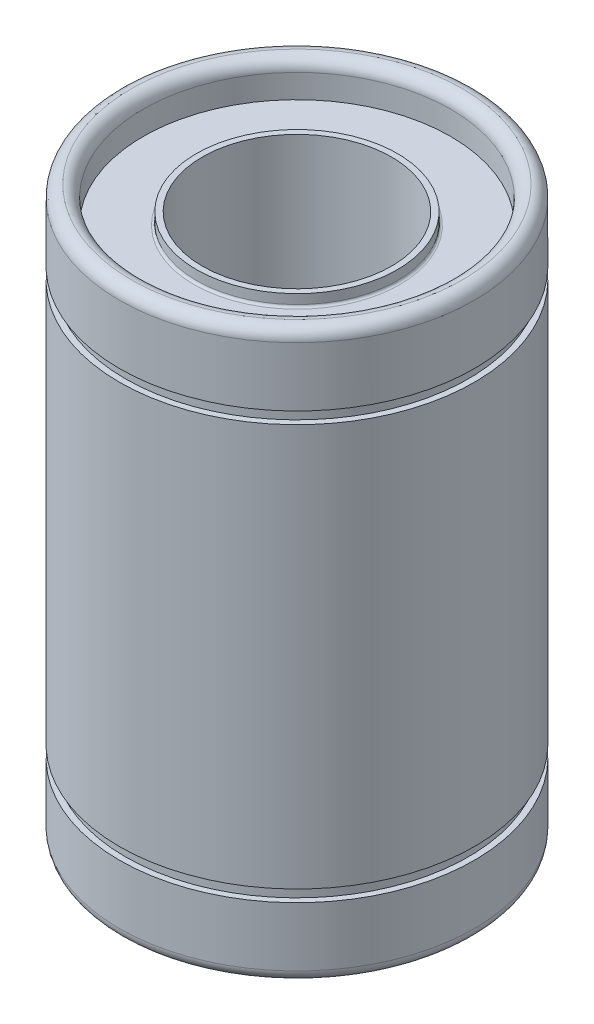
ISO-10303-21;
HEADER;
FILE_DESCRIPTION(('STEP AP214'),'2;1');
FILE_NAME('part.step','',(''),(''),'','','');
FILE_SCHEMA(('AUTOMOTIVE_DESIGN { 1 0 10303 214 1 1 1 1 }'));
ENDSEC;
DATA;
#1=APPLICATION_CONTEXT('core data for automotive mechanical design processes');
#2=APPLICATION_PROTOCOL_DEFINITION('international standard','automotive_design',2000,#1);
#3=PRODUCT_CONTEXT('',#1,'mechanical');
#4=PRODUCT('Part','Part','',(#3));
#5=PRODUCT_RELATED_PRODUCT_CATEGORY('part','',(#4));
#6=PRODUCT_DEFINITION_FORMATION('','',#4);
#7=PRODUCT_DEFINITION_CONTEXT('part definition',#1,'design');
#8=PRODUCT_DEFINITION('design','',#6,#7);
#9=PRODUCT_DEFINITION_SHAPE('','',#8);
#10=(LENGTH_UNIT() NAMED_UNIT(*) SI_UNIT(.MILLI.,.METRE.));
#11=(NAMED_UNIT(*) PLANE_ANGLE_UNIT() SI_UNIT($,.RADIAN.));
#12=(NAMED_UNIT(*) SI_UNIT($,.STERADIAN.) SOLID_ANGLE_UNIT());
#13=UNCERTAINTY_MEASURE_WITH_UNIT(LENGTH_MEASURE(1.E-05),#10,'distance_accuracy_value','');
#14=(GEOMETRIC_REPRESENTATION_CONTEXT(3) GLOBAL_UNCERTAINTY_ASSIGNED_CONTEXT((#13)) GLOBAL_UNIT_ASSIGNED_CONTEXT((#10,
#11,#12)) REPRESENTATION_CONTEXT('',''));
#15=CARTESIAN_POINT('',(0.,0.,0.));
#16=DIRECTION('',(0.,0.,1.));
#17=DIRECTION('',(1.,0.,0.));
#18=AXIS2_PLACEMENT_3D('',#15,#16,#17);
#19=CARTESIAN_POINT('',(0.,22.5,0.));
#20=DIRECTION('',(0.,1.,0.));
#21=DIRECTION('',(0.,0.,1.));
#22=AXIS2_PLACEMENT_3D('',#19,#20,#21);
#23=PLANE('',#22);
#24=CARTESIAN_POINT('',(0.,22.5,0.));
#25=DIRECTION('',(0.,1.,0.));
#26=DIRECTION('',(0.,0.,1.));
#27=AXIS2_PLACEMENT_3D('',#24,#25,#26);
#28=CIRCLE('',#27,4.35);
#29=CARTESIAN_POINT('',(0.,22.5,4.35));
#30=VERTEX_POINT('',#29);
#31=EDGE_CURVE('E10',#30,#30,#28,.F.);
#32=ORIENTED_EDGE('',*,*,#31,.T.);
#33=EDGE_LOOP('',(#32));
#34=FACE_BOUND('',#33,.T.);
#35=CARTESIAN_POINT('',(0.,22.5,0.));
#36=DIRECTION('',(0.,1.,0.));
#37=DIRECTION('',(0.,0.,1.));
#38=AXIS2_PLACEMENT_3D('',#35,#36,#37);
#39=CIRCLE('',#38,6.5);
#40=CARTESIAN_POINT('',(0.,22.5,6.5));
#41=VERTEX_POINT('',#40);
#42=EDGE_CURVE('E99',#41,#41,#39,.T.);
#43=ORIENTED_EDGE('',*,*,#42,.T.);
#44=EDGE_LOOP('',(#43));
#45=FACE_BOUND('',#44,.T.);
#46=ADVANCED_FACE('F36',(#34,#45),#23,.T.);
#47=CARTESIAN_POINT('',(0.,24.,0.));
#48=DIRECTION('',(0.,1.,0.));
#49=DIRECTION('',(0.,0.,1.));
#50=AXIS2_PLACEMENT_3D('',#47,#48,#49);
#51=CYLINDRICAL_SURFACE('',#50,7.5);
#52=CARTESIAN_POINT('',(0.,0.5,0.));
#53=DIRECTION('',(0.,1.,0.));
#54=DIRECTION('',(0.,0.,1.));
#55=AXIS2_PLACEMENT_3D('',#52,#53,#54);
#56=CIRCLE('',#55,7.5);
#57=CARTESIAN_POINT('',(0.,0.5,7.5));
#58=VERTEX_POINT('',#57);
#59=EDGE_CURVE('E63',#58,#58,#56,.T.);
#60=ORIENTED_EDGE('',*,*,#59,.T.);
#61=EDGE_LOOP('',(#60));
#62=FACE_BOUND('',#61,.T.);
#63=CARTESIAN_POINT('',(0.,3.,0.));
#64=DIRECTION('',(0.,1.,0.));
#65=DIRECTION('',(0.,0.,1.));
#66=AXIS2_PLACEMENT_3D('',#63,#64,#65);
#67=CIRCLE('',#66,7.5);
#68=CARTESIAN_POINT('',(0.,3.,7.5));
#69=VERTEX_POINT('',#68);
#70=EDGE_CURVE('E75',#69,#69,#67,.T.);
#71=ORIENTED_EDGE('',*,*,#70,.F.);
#72=EDGE_LOOP('',(#71));
#73=FACE_BOUND('',#72,.T.);
#74=ADVANCED_FACE('F138',(#62,#73),#51,.T.);
#75=CARTESIAN_POINT('',(7.25,3.,0.));
#76=DIRECTION('',(0.,-1.,0.));
#77=DIRECTION('',(0.,0.,-1.));
#78=AXIS2_PLACEMENT_3D('',#75,#76,#77);
#79=PLANE('',#78);
#80=CARTESIAN_POINT('',(0.,3.,0.));
#81=DIRECTION('',(0.,1.,0.));
#82=DIRECTION('',(0.,0.,1.));
#83=AXIS2_PLACEMENT_3D('',#80,#81,#82);
#84=CIRCLE('',#83,7.25);
#85=CARTESIAN_POINT('',(0.,3.,7.25));
#86=VERTEX_POINT('',#85);
#87=EDGE_CURVE('E78',#86,#86,#84,.T.);
#88=ORIENTED_EDGE('',*,*,#87,.F.);
#89=EDGE_LOOP('',(#88));
#90=FACE_BOUND('',#89,.T.);
#91=ORIENTED_EDGE('',*,*,#70,.T.);
#92=EDGE_LOOP('',(#91));
#93=FACE_BOUND('',#92,.T.);
#94=ADVANCED_FACE('F143',(#90,#93),#79,.F.);
#95=CARTESIAN_POINT('',(0.,24.,0.));
#96=DIRECTION('',(0.,1.,0.));
#97=DIRECTION('',(0.,0.,1.));
#98=AXIS2_PLACEMENT_3D('',#95,#96,#97);
#99=CYLINDRICAL_SURFACE('',#98,7.25);
#100=CARTESIAN_POINT('',(0.,3.5,0.));
#101=DIRECTION('',(0.,1.,0.));
#102=DIRECTION('',(0.,0.,1.));
#103=AXIS2_PLACEMENT_3D('',#100,#101,#102);
#104=CIRCLE('',#103,7.25);
#105=CARTESIAN_POINT('',(0.,3.5,7.25));
#106=VERTEX_POINT('',#105);
#107=EDGE_CURVE('E81',#106,#106,#104,.T.);
#108=ORIENTED_EDGE('',*,*,#107,.F.);
#109=EDGE_LOOP('',(#108));
#110=FACE_BOUND('',#109,.T.);
#111=ORIENTED_EDGE('',*,*,#87,.T.);
#112=EDGE_LOOP('',(#111));
#113=FACE_BOUND('',#112,.T.);
#114=ADVANCED_FACE('F176',(#110,#113),#99,.T.);
#115=CARTESIAN_POINT('',(7.5,3.5,0.));
#116=DIRECTION('',(0.,1.,0.));
#117=DIRECTION('',(0.,0.,1.));
#118=AXIS2_PLACEMENT_3D('',#115,#116,#117);
#119=PLANE('',#118);
#120=CARTESIAN_POINT('',(0.,3.5,0.));
#121=DIRECTION('',(0.,1.,0.));
#122=DIRECTION('',(0.,0.,1.));
#123=AXIS2_PLACEMENT_3D('',#120,#121,#122);
#124=CIRCLE('',#123,7.5);
#125=CARTESIAN_POINT('',(0.,3.5,7.5));
#126=VERTEX_POINT('',#125);
#127=EDGE_CURVE('E84',#126,#126,#124,.T.);
#128=ORIENTED_EDGE('',*,*,#127,.F.);
#129=EDGE_LOOP('',(#128));
#130=FACE_BOUND('',#129,.T.);
#131=ORIENTED_EDGE('',*,*,#107,.T.);
#132=EDGE_LOOP('',(#131));
#133=FACE_BOUND('',#132,.T.);
#134=ADVANCED_FACE('F172',(#130,#133),#119,.F.);
#135=CARTESIAN_POINT('',(0.,24.,0.));
#136=DIRECTION('',(0.,1.,0.));
#137=DIRECTION('',(0.,0.,1.));
#138=AXIS2_PLACEMENT_3D('',#135,#136,#137);
#139=CYLINDRICAL_SURFACE('',#138,7.5);
#140=CARTESIAN_POINT('',(0.,20.5,0.));
#141=DIRECTION('',(0.,1.,0.));
#142=DIRECTION('',(0.,0.,1.));
#143=AXIS2_PLACEMENT_3D('',#140,#141,#142);
#144=CIRCLE('',#143,7.5);
#145=CARTESIAN_POINT('',(0.,20.5,7.5));
#146=VERTEX_POINT('',#145);
#147=EDGE_CURVE('E87',#146,#146,#144,.T.);
#148=ORIENTED_EDGE('',*,*,#147,.F.);
#149=EDGE_LOOP('',(#148));
#150=FACE_BOUND('',#149,.T.);
#151=ORIENTED_EDGE('',*,*,#127,.T.);
#152=EDGE_LOOP('',(#151));
#153=FACE_BOUND('',#152,.T.);
#154=ADVANCED_FACE('F168',(#150,#153),#139,.T.);
#155=CARTESIAN_POINT('',(7.25,20.5,0.));
#156=DIRECTION('',(0.,-1.,0.));
#157=DIRECTION('',(0.,0.,-1.));
#158=AXIS2_PLACEMENT_3D('',#155,#156,#157);
#159=PLANE('',#158);
#160=CARTESIAN_POINT('',(0.,20.5,0.));
#161=DIRECTION('',(0.,1.,0.));
#162=DIRECTION('',(0.,0.,1.));
#163=AXIS2_PLACEMENT_3D('',#160,#161,#162);
#164=CIRCLE('',#163,7.25);
#165=CARTESIAN_POINT('',(0.,20.5,7.25));
#166=VERTEX_POINT('',#165);
#167=EDGE_CURVE('E90',#166,#166,#164,.T.);
#168=ORIENTED_EDGE('',*,*,#167,.F.);
#169=EDGE_LOOP('',(#168));
#170=FACE_BOUND('',#169,.T.);
#171=ORIENTED_EDGE('',*,*,#147,.T.);
#172=EDGE_LOOP('',(#171));
#173=FACE_BOUND('',#172,.T.);
#174=ADVANCED_FACE('F164',(#170,#173),#159,.F.);
#175=CARTESIAN_POINT('',(0.,24.,0.));
#176=DIRECTION('',(0.,1.,0.));
#177=DIRECTION('',(0.,0.,1.));
#178=AXIS2_PLACEMENT_3D('',#175,#176,#177);
#179=CYLINDRICAL_SURFACE('',#178,7.25);
#180=CARTESIAN_POINT('',(0.,21.,0.));
#181=DIRECTION('',(0.,1.,0.));
#182=DIRECTION('',(0.,0.,1.));
#183=AXIS2_PLACEMENT_3D('',#180,#181,#182);
#184=CIRCLE('',#183,7.25);
#185=CARTESIAN_POINT('',(0.,21.,7.25));
#186=VERTEX_POINT('',#185);
#187=EDGE_CURVE('E93',#186,#186,#184,.T.);
#188=ORIENTED_EDGE('',*,*,#187,.F.);
#189=EDGE_LOOP('',(#188));
#190=FACE_BOUND('',#189,.T.);
#191=ORIENTED_EDGE('',*,*,#167,.T.);
#192=EDGE_LOOP('',(#191));
#193=FACE_BOUND('',#192,.T.);
#194=ADVANCED_FACE('F160',(#190,#193),#179,.T.);
#195=CARTESIAN_POINT('',(7.5,21.,0.));
#196=DIRECTION('',(0.,1.,0.));
#197=DIRECTION('',(0.,0.,1.));
#198=AXIS2_PLACEMENT_3D('',#195,#196,#197);
#199=PLANE('',#198);
#200=CARTESIAN_POINT('',(0.,21.,0.));
#201=DIRECTION('',(0.,1.,0.));
#202=DIRECTION('',(0.,0.,1.));
#203=AXIS2_PLACEMENT_3D('',#200,#201,#202);
#204=CIRCLE('',#203,7.5);
#205=CARTESIAN_POINT('',(0.,21.,7.5));
#206=VERTEX_POINT('',#205);
#207=EDGE_CURVE('E96',#206,#206,#204,.T.);
#208=ORIENTED_EDGE('',*,*,#207,.F.);
#209=EDGE_LOOP('',(#208));
#210=FACE_BOUND('',#209,.T.);
#211=ORIENTED_EDGE('',*,*,#187,.T.);
#212=EDGE_LOOP('',(#211));
#213=FACE_BOUND('',#212,.T.);
#214=ADVANCED_FACE('F156',(#210,#213),#199,.F.);
#215=CARTESIAN_POINT('',(0.,24.,0.));
#216=DIRECTION('',(0.,1.,0.));
#217=DIRECTION('',(0.,0.,1.));
#218=AXIS2_PLACEMENT_3D('',#215,#216,#217);
#219=CYLINDRICAL_SURFACE('',#218,7.5);
#220=CARTESIAN_POINT('',(0.,23.5,0.));
#221=DIRECTION('',(0.,-1.,0.));
#222=DIRECTION('',(0.,0.,-1.));
#223=AXIS2_PLACEMENT_3D('',#220,#221,#222);
#224=CIRCLE('',#223,7.5);
#225=CARTESIAN_POINT('',(0.,23.5,-7.5));
#226=VERTEX_POINT('',#225);
#227=EDGE_CURVE('E72',#226,#226,#224,.T.);
#228=ORIENTED_EDGE('',*,*,#227,.T.);
#229=EDGE_LOOP('',(#228));
#230=FACE_BOUND('',#229,.T.);
#231=ORIENTED_EDGE('',*,*,#207,.T.);
#232=EDGE_LOOP('',(#231));
#233=FACE_BOUND('',#232,.T.);
#234=ADVANCED_FACE('F152',(#230,#233),#219,.T.);
#235=CARTESIAN_POINT('',(0.,22.5,0.));
#236=DIRECTION('',(0.,1.,0.));
#237=DIRECTION('',(0.,0.,1.));
#238=AXIS2_PLACEMENT_3D('',#235,#236,#237);
#239=CYLINDRICAL_SURFACE('',#238,6.5);
#240=CARTESIAN_POINT('',(0.,23.5,0.));
#241=DIRECTION('',(0.,-1.,0.));
#242=DIRECTION('',(0.,0.,-1.));
#243=AXIS2_PLACEMENT_3D('',#240,#241,#242);
#244=CIRCLE('',#243,6.5);
#245=CARTESIAN_POINT('',(0.,23.5,-6.5));
#246=VERTEX_POINT('',#245);
#247=EDGE_CURVE('E66',#246,#246,#244,.F.);
#248=ORIENTED_EDGE('',*,*,#247,.T.);
#249=EDGE_LOOP('',(#248));
#250=FACE_BOUND('',#249,.T.);
#251=ORIENTED_EDGE('',*,*,#42,.F.);
#252=EDGE_LOOP('',(#251));
#253=FACE_BOUND('',#252,.T.);
#254=ADVANCED_FACE('F149',(#250,#253),#239,.F.);
#255=CARTESIAN_POINT('',(0.,1.5,0.));
#256=DIRECTION('',(0.,-1.,0.));
#257=DIRECTION('',(0.,0.,-1.));
#258=AXIS2_PLACEMENT_3D('',#255,#256,#257);
#259=CYLINDRICAL_SURFACE('',#258,6.5);
#260=CARTESIAN_POINT('',(0.,0.5,0.));
#261=DIRECTION('',(0.,1.,0.));
#262=DIRECTION('',(0.,0.,1.));
#263=AXIS2_PLACEMENT_3D('',#260,#261,#262);
#264=CIRCLE('',#263,6.5);
#265=CARTESIAN_POINT('',(0.,0.5,6.5));
#266=VERTEX_POINT('',#265);
#267=EDGE_CURVE('E56',#266,#266,#264,.F.);
#268=ORIENTED_EDGE('',*,*,#267,.T.);
#269=EDGE_LOOP('',(#268));
#270=FACE_BOUND('',#269,.T.);
#271=CARTESIAN_POINT('',(0.,1.5,0.));
#272=DIRECTION('',(0.,-1.,0.));
#273=DIRECTION('',(0.,0.,-1.));
#274=AXIS2_PLACEMENT_3D('',#271,#272,#273);
#275=CIRCLE('',#274,6.5);
#276=CARTESIAN_POINT('',(0.,1.5,-6.5));
#277=VERTEX_POINT('',#276);
#278=EDGE_CURVE('E102',#277,#277,#275,.T.);
#279=ORIENTED_EDGE('',*,*,#278,.F.);
#280=EDGE_LOOP('',(#279));
#281=FACE_BOUND('',#280,.T.);
#282=ADVANCED_FACE('F133',(#270,#281),#259,.F.);
#283=CARTESIAN_POINT('',(0.,1.5,0.));
#284=DIRECTION('',(0.,-1.,0.));
#285=DIRECTION('',(0.,0.,-1.));
#286=AXIS2_PLACEMENT_3D('',#283,#284,#285);
#287=PLANE('',#286);
#288=CARTESIAN_POINT('',(0.,1.5,0.));
#289=DIRECTION('',(0.,-1.,0.));
#290=DIRECTION('',(0.,0.,-1.));
#291=AXIS2_PLACEMENT_3D('',#288,#289,#290);
#292=CIRCLE('',#291,4.35);
#293=CARTESIAN_POINT('',(0.,1.5,-4.35));
#294=VERTEX_POINT('',#293);
#295=EDGE_CURVE('E47',#294,#294,#292,.F.);
#296=ORIENTED_EDGE('',*,*,#295,.T.);
#297=EDGE_LOOP('',(#296));
#298=FACE_BOUND('',#297,.T.);
#299=ORIENTED_EDGE('',*,*,#278,.T.);
#300=EDGE_LOOP('',(#299));
#301=FACE_BOUND('',#300,.T.);
#302=ADVANCED_FACE('F123',(#298,#301),#287,.T.);
#303=CARTESIAN_POINT('',(0.,0.,0.));
#304=DIRECTION('',(0.,1.,0.));
#305=DIRECTION('',(0.,0.,1.));
#306=AXIS2_PLACEMENT_3D('',#303,#304,#305);
#307=CYLINDRICAL_SURFACE('',#306,4.);
#308=CARTESIAN_POINT('',(0.,23.,0.));
#309=DIRECTION('',(0.,1.,0.));
#310=DIRECTION('',(0.,0.,1.));
#311=AXIS2_PLACEMENT_3D('',#308,#309,#310);
#312=CIRCLE('',#311,4.);
#313=CARTESIAN_POINT('',(0.,23.,4.));
#314=VERTEX_POINT('',#313);
#315=EDGE_CURVE('E108',#314,#314,#312,.T.);
#316=CARTESIAN_POINT('',(0.,1.,0.));
#317=DIRECTION('',(0.,1.,0.));
#318=DIRECTION('',(0.,0.,1.));
#319=AXIS2_PLACEMENT_3D('',#316,#317,#318);
#320=CIRCLE('',#319,4.);
#321=CARTESIAN_POINT('',(0.,1.,4.));
#322=VERTEX_POINT('',#321);
#323=EDGE_CURVE('E69',#322,#322,#320,.T.);
#324=CARTESIAN_POINT('',(0.,23.,4.));
#325=CARTESIAN_POINT('',(0.,22.7708333333333,4.));
#326=CARTESIAN_POINT('',(0.,22.5416666666667,4.));
#327=CARTESIAN_POINT('',(0.,22.0833333333333,4.));
#328=CARTESIAN_POINT('',(0.,21.8541666666667,4.));
#329=CARTESIAN_POINT('',(0.,21.3958333333333,4.));
#330=CARTESIAN_POINT('',(0.,21.1666666666667,4.));
#331=CARTESIAN_POINT('',(0.,20.7083333333333,4.));
#332=CARTESIAN_POINT('',(0.,20.4791666666667,4.));
#333=CARTESIAN_POINT('',(0.,20.0208333333333,4.));
#334=CARTESIAN_POINT('',(0.,19.7916666666667,4.));
#335=CARTESIAN_POINT('',(0.,19.3333333333333,4.));
#336=CARTESIAN_POINT('',(0.,19.1041666666667,4.));
#337=CARTESIAN_POINT('',(0.,18.6458333333333,4.));
#338=CARTESIAN_POINT('',(0.,18.4166666666667,4.));
#339=CARTESIAN_POINT('',(0.,17.9583333333333,4.));
#340=CARTESIAN_POINT('',(0.,17.7291666666667,4.));
#341=CARTESIAN_POINT('',(0.,17.2708333333333,4.));
#342=CARTESIAN_POINT('',(0.,17.0416666666667,4.));
#343=CARTESIAN_POINT('',(0.,16.5833333333333,4.));
#344=CARTESIAN_POINT('',(0.,16.3541666666667,4.));
#345=CARTESIAN_POINT('',(0.,15.8958333333333,4.));
#346=CARTESIAN_POINT('',(0.,15.6666666666667,4.));
#347=CARTESIAN_POINT('',(0.,15.2083333333333,4.));
#348=CARTESIAN_POINT('',(0.,14.9791666666667,4.));
#349=CARTESIAN_POINT('',(0.,14.5208333333333,4.));
#350=CARTESIAN_POINT('',(0.,14.2916666666667,4.));
#351=CARTESIAN_POINT('',(0.,13.8333333333333,4.));
#352=CARTESIAN_POINT('',(0.,13.6041666666667,4.));
#353=CARTESIAN_POINT('',(0.,13.1458333333333,4.));
#354=CARTESIAN_POINT('',(0.,12.9166666666667,4.));
#355=CARTESIAN_POINT('',(0.,12.4583333333333,4.));
#356=CARTESIAN_POINT('',(0.,12.2291666666667,4.));
#357=CARTESIAN_POINT('',(0.,11.7708333333333,4.));
#358=CARTESIAN_POINT('',(0.,11.5416666666667,4.));
#359=CARTESIAN_POINT('',(0.,11.0833333333333,4.));
#360=CARTESIAN_POINT('',(0.,10.8541666666667,4.));
#361=CARTESIAN_POINT('',(0.,10.3958333333333,4.));
#362=CARTESIAN_POINT('',(0.,10.1666666666667,4.));
#363=CARTESIAN_POINT('',(0.,9.70833333333333,4.));
#364=CARTESIAN_POINT('',(0.,9.47916666666667,4.));
#365=CARTESIAN_POINT('',(0.,9.02083333333333,4.));
#366=CARTESIAN_POINT('',(0.,8.79166666666667,4.));
#367=CARTESIAN_POINT('',(0.,8.33333333333333,4.));
#368=CARTESIAN_POINT('',(0.,8.10416666666667,4.));
#369=CARTESIAN_POINT('',(0.,7.64583333333333,4.));
#370=CARTESIAN_POINT('',(0.,7.41666666666667,4.));
#371=CARTESIAN_POINT('',(0.,6.95833333333333,4.));
#372=CARTESIAN_POINT('',(0.,6.72916666666666,4.));
#373=CARTESIAN_POINT('',(0.,6.27083333333333,4.));
#374=CARTESIAN_POINT('',(0.,6.04166666666667,4.));
#375=CARTESIAN_POINT('',(0.,5.58333333333333,4.));
#376=CARTESIAN_POINT('',(0.,5.35416666666667,4.));
#377=CARTESIAN_POINT('',(0.,4.89583333333333,4.));
#378=CARTESIAN_POINT('',(0.,4.66666666666667,4.));
#379=CARTESIAN_POINT('',(0.,4.20833333333333,4.));
#380=CARTESIAN_POINT('',(0.,3.97916666666667,4.));
#381=CARTESIAN_POINT('',(0.,3.52083333333333,4.));
#382=CARTESIAN_POINT('',(0.,3.29166666666667,4.));
#383=CARTESIAN_POINT('',(0.,2.83333333333333,4.));
#384=CARTESIAN_POINT('',(0.,2.60416666666667,4.));
#385=CARTESIAN_POINT('',(0.,2.14583333333333,4.));
#386=CARTESIAN_POINT('',(0.,1.91666666666667,4.));
#387=CARTESIAN_POINT('',(0.,1.45833333333333,4.));
#388=CARTESIAN_POINT('',(0.,1.22916666666667,4.));
#389=CARTESIAN_POINT('',(0.,1.,4.));
#390=B_SPLINE_CURVE_WITH_KNOTS('',3,(#324,#325,#326,#327,#328,#329,#330,#331,#332,#333,#334,
#335,#336,#337,#338,#339,#340,#341,#342,#343,#344,#345,#346,#347,#348,#349,#350,#351,#352,#353,
#354,#355,#356,#357,#358,#359,#360,#361,#362,#363,#364,#365,#366,#367,#368,#369,#370,#371,#372,
#373,#374,#375,#376,#377,#378,#379,#380,#381,#382,#383,#384,#385,#386,#387,#388,#389),
.UNSPECIFIED.,.F.,.F.,(4,2,2,2,2,2,2,2,2,2,2,2,2,2,2,2,2,2,2,2,2,2,2,2,2,2,2,2,2,2,2,2,4),(0.,
0.687500000000001,1.375,2.0625,2.75,3.4375,4.125,4.8125,5.5,6.1875,6.875,7.5625,8.25,8.9375,
9.625,10.3125,11.,11.6875,12.375,13.0625,13.75,14.4375,15.125,15.8125,16.5,17.1875,17.875,
18.5625,19.25,19.9375,20.625,21.3125,22.),.UNSPECIFIED.);
#391=EDGE_CURVE('BSEAM120',#314,#322,#390,.T.);
#392=ORIENTED_EDGE('',*,*,#315,.T.);
#393=ORIENTED_EDGE('',*,*,#323,.F.);
#394=ORIENTED_EDGE('',*,*,#391,.T.);
#395=ORIENTED_EDGE('',*,*,#391,.F.);
#396=EDGE_LOOP('',(#392,#394,#393,#395));
#397=FACE_BOUND('',#396,.T.);
#398=ADVANCED_FACE('F120',(#397),#307,.F.);
#399=CARTESIAN_POINT('',(0.,23.,0.));
#400=DIRECTION('',(0.,1.,0.));
#401=DIRECTION('',(0.,0.,1.));
#402=AXIS2_PLACEMENT_3D('',#399,#400,#401);
#403=PLANE('',#402);
#404=CARTESIAN_POINT('',(0.,23.,0.));
#405=DIRECTION('',(0.,1.,0.));
#406=DIRECTION('',(0.,0.,1.));
#407=AXIS2_PLACEMENT_3D('',#404,#405,#406);
#408=CIRCLE('',#407,4.25);
#409=CARTESIAN_POINT('',(0.,23.,4.25));
#410=VERTEX_POINT('',#409);
#411=EDGE_CURVE('E105',#410,#410,#408,.T.);
#412=ORIENTED_EDGE('',*,*,#411,.T.);
#413=EDGE_LOOP('',(#412));
#414=FACE_BOUND('',#413,.T.);
#415=ORIENTED_EDGE('',*,*,#315,.F.);
#416=EDGE_LOOP('',(#415));
#417=FACE_BOUND('',#416,.T.);
#418=ADVANCED_FACE('F122',(#414,#417),#403,.T.);
#419=CARTESIAN_POINT('',(0.,23.,0.));
#420=DIRECTION('',(0.,-1.,0.));
#421=DIRECTION('',(0.,0.,-1.));
#422=AXIS2_PLACEMENT_3D('',#419,#420,#421);
#423=CYLINDRICAL_SURFACE('',#422,4.25);
#424=CARTESIAN_POINT('',(0.,22.6,0.));
#425=DIRECTION('',(0.,1.,0.));
#426=DIRECTION('',(0.,0.,1.));
#427=AXIS2_PLACEMENT_3D('',#424,#425,#426);
#428=CIRCLE('',#427,4.25);
#429=CARTESIAN_POINT('',(0.,22.6,4.25));
#430=VERTEX_POINT('',#429);
#431=EDGE_CURVE('E43',#430,#430,#428,.T.);
#432=ORIENTED_EDGE('',*,*,#431,.T.);
#433=EDGE_LOOP('',(#432));
#434=FACE_BOUND('',#433,.T.);
#435=ORIENTED_EDGE('',*,*,#411,.F.);
#436=EDGE_LOOP('',(#435));
#437=FACE_BOUND('',#436,.T.);
#438=ADVANCED_FACE('F130',(#434,#437),#423,.T.);
#439=CARTESIAN_POINT('',(0.,1.,0.));
#440=DIRECTION('',(0.,1.,0.));
#441=DIRECTION('',(0.,0.,1.));
#442=AXIS2_PLACEMENT_3D('',#439,#440,#441);
#443=CYLINDRICAL_SURFACE('',#442,4.25);
#444=CARTESIAN_POINT('',(0.,1.4,0.));
#445=DIRECTION('',(0.,-1.,0.));
#446=DIRECTION('',(0.,0.,-1.));
#447=AXIS2_PLACEMENT_3D('',#444,#445,#446);
#448=CIRCLE('',#447,4.25);
#449=CARTESIAN_POINT('',(0.,1.4,-4.25));
#450=VERTEX_POINT('',#449);
#451=EDGE_CURVE('E51',#450,#450,#448,.T.);
#452=ORIENTED_EDGE('',*,*,#451,.T.);
#453=EDGE_LOOP('',(#452));
#454=FACE_BOUND('',#453,.T.);
#455=CARTESIAN_POINT('',(0.,1.,0.));
#456=DIRECTION('',(0.,1.,0.));
#457=DIRECTION('',(0.,0.,1.));
#458=AXIS2_PLACEMENT_3D('',#455,#456,#457);
#459=CIRCLE('',#458,4.25);
#460=CARTESIAN_POINT('',(0.,1.,4.25));
#461=VERTEX_POINT('',#460);
#462=EDGE_CURVE('E111',#461,#461,#459,.T.);
#463=ORIENTED_EDGE('',*,*,#462,.T.);
#464=EDGE_LOOP('',(#463));
#465=FACE_BOUND('',#464,.T.);
#466=ADVANCED_FACE('F210',(#454,#465),#443,.T.);
#467=CARTESIAN_POINT('',(0.,1.,0.));
#468=DIRECTION('',(0.,-1.,0.));
#469=DIRECTION('',(0.,0.,1.));
#470=AXIS2_PLACEMENT_3D('',#467,#468,#469);
#471=PLANE('',#470);
#472=ORIENTED_EDGE('',*,*,#323,.T.);
#473=EDGE_LOOP('',(#472));
#474=FACE_BOUND('',#473,.T.);
#475=ORIENTED_EDGE('',*,*,#462,.F.);
#476=EDGE_LOOP('',(#475));
#477=FACE_BOUND('',#476,.T.);
#478=ADVANCED_FACE('F117',(#474,#477),#471,.T.);
#479=CARTESIAN_POINT('',(0.,23.5,0.));
#480=DIRECTION('',(0.,-1.,0.));
#481=DIRECTION('',(0.,0.,-1.));
#482=AXIS2_PLACEMENT_3D('',#479,#480,#481);
#483=TOROIDAL_SURFACE('',#482,7.,0.5);
#484=ORIENTED_EDGE('',*,*,#247,.F.);
#485=EDGE_LOOP('',(#484));
#486=FACE_BOUND('',#485,.T.);
#487=CARTESIAN_POINT('',(0.,24.,0.));
#488=DIRECTION('',(0.,-1.,0.));
#489=DIRECTION('',(0.,0.,-1.));
#490=AXIS2_PLACEMENT_3D('',#487,#488,#489);
#491=CIRCLE('',#490,7.);
#492=CARTESIAN_POINT('',(0.,24.,-7.));
#493=VERTEX_POINT('',#492);
#494=EDGE_CURVE('E60',#493,#493,#491,.T.);
#495=ORIENTED_EDGE('',*,*,#494,.F.);
#496=EDGE_LOOP('',(#495));
#497=FACE_BOUND('',#496,.T.);
#498=ADVANCED_FACE('F188',(#486,#497),#483,.T.);
#499=CARTESIAN_POINT('',(0.,23.5,0.));
#500=DIRECTION('',(0.,-1.,0.));
#501=DIRECTION('',(0.,0.,-1.));
#502=AXIS2_PLACEMENT_3D('',#499,#500,#501);
#503=TOROIDAL_SURFACE('',#502,7.,0.5);
#504=ORIENTED_EDGE('',*,*,#227,.F.);
#505=EDGE_LOOP('',(#504));
#506=FACE_BOUND('',#505,.T.);
#507=ORIENTED_EDGE('',*,*,#494,.T.);
#508=EDGE_LOOP('',(#507));
#509=FACE_BOUND('',#508,.T.);
#510=ADVANCED_FACE('F184',(#506,#509),#503,.T.);
#511=CARTESIAN_POINT('',(0.,0.5,0.));
#512=DIRECTION('',(0.,1.,0.));
#513=DIRECTION('',(0.,0.,1.));
#514=AXIS2_PLACEMENT_3D('',#511,#512,#513);
#515=TOROIDAL_SURFACE('',#514,7.,0.5);
#516=ORIENTED_EDGE('',*,*,#267,.F.);
#517=EDGE_LOOP('',(#516));
#518=FACE_BOUND('',#517,.T.);
#519=CARTESIAN_POINT('',(0.,0.,0.));
#520=DIRECTION('',(0.,1.,0.));
#521=DIRECTION('',(0.,0.,1.));
#522=AXIS2_PLACEMENT_3D('',#519,#520,#521);
#523=CIRCLE('',#522,7.);
#524=CARTESIAN_POINT('',(0.,0.,7.));
#525=VERTEX_POINT('',#524);
#526=EDGE_CURVE('E57',#525,#525,#523,.T.);
#527=ORIENTED_EDGE('',*,*,#526,.F.);
#528=EDGE_LOOP('',(#527));
#529=FACE_BOUND('',#528,.T.);
#530=ADVANCED_FACE('F187',(#518,#529),#515,.T.);
#531=CARTESIAN_POINT('',(0.,0.5,0.));
#532=DIRECTION('',(0.,1.,0.));
#533=DIRECTION('',(0.,0.,1.));
#534=AXIS2_PLACEMENT_3D('',#531,#532,#533);
#535=TOROIDAL_SURFACE('',#534,7.,0.5);
#536=ORIENTED_EDGE('',*,*,#526,.T.);
#537=EDGE_LOOP('',(#536));
#538=FACE_BOUND('',#537,.T.);
#539=ORIENTED_EDGE('',*,*,#59,.F.);
#540=EDGE_LOOP('',(#539));
#541=FACE_BOUND('',#540,.T.);
#542=ADVANCED_FACE('F193',(#538,#541),#535,.T.);
#543=CARTESIAN_POINT('',(0.,1.4,0.));
#544=DIRECTION('',(0.,-1.,0.));
#545=DIRECTION('',(0.,0.,-1.));
#546=AXIS2_PLACEMENT_3D('',#543,#544,#545);
#547=TOROIDAL_SURFACE('',#546,4.35,0.1);
#548=ORIENTED_EDGE('',*,*,#295,.F.);
#549=EDGE_LOOP('',(#548));
#550=FACE_BOUND('',#549,.T.);
#551=ORIENTED_EDGE('',*,*,#451,.F.);
#552=EDGE_LOOP('',(#551));
#553=FACE_BOUND('',#552,.T.);
#554=ADVANCED_FACE('F196',(#550,#553),#547,.F.);
#555=CARTESIAN_POINT('',(0.,22.6,0.));
#556=DIRECTION('',(0.,1.,0.));
#557=DIRECTION('',(0.,0.,1.));
#558=AXIS2_PLACEMENT_3D('',#555,#556,#557);
#559=TOROIDAL_SURFACE('',#558,4.35,0.1);
#560=ORIENTED_EDGE('',*,*,#31,.F.);
#561=EDGE_LOOP('',(#560));
#562=FACE_BOUND('',#561,.T.);
#563=ORIENTED_EDGE('',*,*,#431,.F.);
#564=EDGE_LOOP('',(#563));
#565=FACE_BOUND('',#564,.T.);
#566=ADVANCED_FACE('F38',(#562,#565),#559,.F.);
#567=CLOSED_SHELL('',(#46,#74,#94,#114,#134,#154,#174,#194,#214,#234,#254,#282,#302,#398,#418,
#438,#466,#478,#498,#510,#530,#542,#554,#566));
#568=MANIFOLD_SOLID_BREP('B2',#567);
#569=ADVANCED_BREP_SHAPE_REPRESENTATION('',(#18,#568),#14);
#570=SHAPE_DEFINITION_REPRESENTATION(#9,#569);
ENDSEC;
END-ISO-10303-21;
